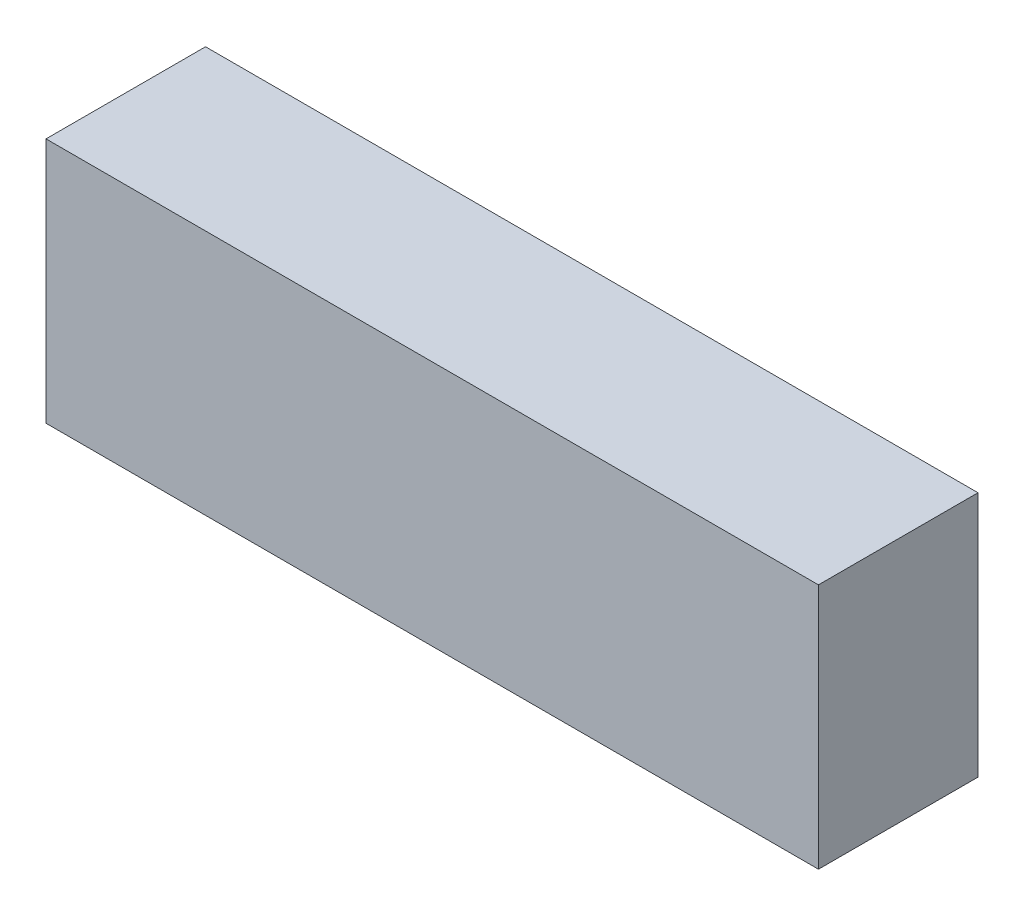
ISO-10303-21;
HEADER;
FILE_DESCRIPTION(('STEP AP214'),'2;1');
FILE_NAME('part.step','',(''),(''),'','','');
FILE_SCHEMA(('AUTOMOTIVE_DESIGN { 1 0 10303 214 1 1 1 1 }'));
ENDSEC;
DATA;
#1=APPLICATION_CONTEXT('core data for automotive mechanical design processes');
#2=APPLICATION_PROTOCOL_DEFINITION('international standard','automotive_design',2000,#1);
#3=PRODUCT_CONTEXT('',#1,'mechanical');
#4=PRODUCT('Part','Part','',(#3));
#5=PRODUCT_RELATED_PRODUCT_CATEGORY('part','',(#4));
#6=PRODUCT_DEFINITION_FORMATION('','',#4);
#7=PRODUCT_DEFINITION_CONTEXT('part definition',#1,'design');
#8=PRODUCT_DEFINITION('design','',#6,#7);
#9=PRODUCT_DEFINITION_SHAPE('','',#8);
#10=(LENGTH_UNIT() NAMED_UNIT(*) SI_UNIT(.MILLI.,.METRE.));
#11=(NAMED_UNIT(*) PLANE_ANGLE_UNIT() SI_UNIT($,.RADIAN.));
#12=(NAMED_UNIT(*) SI_UNIT($,.STERADIAN.) SOLID_ANGLE_UNIT());
#13=UNCERTAINTY_MEASURE_WITH_UNIT(LENGTH_MEASURE(1.E-05),#10,'distance_accuracy_value','');
#14=(GEOMETRIC_REPRESENTATION_CONTEXT(3) GLOBAL_UNCERTAINTY_ASSIGNED_CONTEXT((#13)) GLOBAL_UNIT_ASSIGNED_CONTEXT((#10,
#11,#12)) REPRESENTATION_CONTEXT('',''));
#15=CARTESIAN_POINT('',(0.,0.,0.));
#16=DIRECTION('',(0.,0.,1.));
#17=DIRECTION('',(1.,0.,0.));
#18=AXIS2_PLACEMENT_3D('',#15,#16,#17);
#19=CARTESIAN_POINT('',(0.,0.,28.5));
#20=DIRECTION('',(1.,0.,0.));
#21=DIRECTION('',(0.,0.,-1.));
#22=AXIS2_PLACEMENT_3D('',#19,#20,#21);
#23=PLANE('',#22);
#24=DIRECTION('',(0.,-1.,0.));
#25=VECTOR('',#24,1.);
#26=CARTESIAN_POINT('',(0.,0.,0.));
#27=LINE('',#26,#25);
#28=CARTESIAN_POINT('',(0.,44.,0.));
#29=VERTEX_POINT('',#28);
#30=CARTESIAN_POINT('',(0.,0.,0.));
#31=VERTEX_POINT('',#30);
#32=EDGE_CURVE('E102',#29,#31,#27,.T.);
#33=ORIENTED_EDGE('',*,*,#32,.T.);
#34=DIRECTION('',(0.,0.,-1.));
#35=VECTOR('',#34,1.);
#36=CARTESIAN_POINT('',(0.,0.,28.5));
#37=LINE('',#36,#35);
#38=CARTESIAN_POINT('',(0.,0.,28.5));
#39=VERTEX_POINT('',#38);
#40=EDGE_CURVE('E11',#39,#31,#37,.T.);
#41=ORIENTED_EDGE('',*,*,#40,.F.);
#42=DIRECTION('',(0.,-1.,0.));
#43=VECTOR('',#42,1.);
#44=CARTESIAN_POINT('',(0.,0.,28.5));
#45=LINE('',#44,#43);
#46=CARTESIAN_POINT('',(0.,44.,28.5));
#47=VERTEX_POINT('',#46);
#48=EDGE_CURVE('E90',#47,#39,#45,.T.);
#49=ORIENTED_EDGE('',*,*,#48,.F.);
#50=DIRECTION('',(0.,0.,-1.));
#51=VECTOR('',#50,1.);
#52=CARTESIAN_POINT('',(0.,44.,28.5));
#53=LINE('',#52,#51);
#54=EDGE_CURVE('E98',#47,#29,#53,.T.);
#55=ORIENTED_EDGE('',*,*,#54,.T.);
#56=EDGE_LOOP('',(#33,#41,#49,#55));
#57=FACE_BOUND('',#56,.T.);
#58=ADVANCED_FACE('F39',(#57),#23,.F.);
#59=CARTESIAN_POINT('',(0.,0.,28.5));
#60=DIRECTION('',(0.,1.,0.));
#61=DIRECTION('',(0.,0.,1.));
#62=AXIS2_PLACEMENT_3D('',#59,#60,#61);
#63=PLANE('',#62);
#64=DIRECTION('',(1.,0.,0.));
#65=VECTOR('',#64,1.);
#66=CARTESIAN_POINT('',(0.,0.,0.));
#67=LINE('',#66,#65);
#68=CARTESIAN_POINT('',(138.,0.,0.));
#69=VERTEX_POINT('',#68);
#70=EDGE_CURVE('E94',#31,#69,#67,.T.);
#71=ORIENTED_EDGE('',*,*,#70,.T.);
#72=DIRECTION('',(0.,0.,-1.));
#73=VECTOR('',#72,1.);
#74=CARTESIAN_POINT('',(138.,0.,28.5));
#75=LINE('',#74,#73);
#76=CARTESIAN_POINT('',(138.,0.,28.5));
#77=VERTEX_POINT('',#76);
#78=EDGE_CURVE('E47',#77,#69,#75,.T.);
#79=ORIENTED_EDGE('',*,*,#78,.F.);
#80=DIRECTION('',(1.,0.,0.));
#81=VECTOR('',#80,1.);
#82=CARTESIAN_POINT('',(0.,0.,28.5));
#83=LINE('',#82,#81);
#84=EDGE_CURVE('E85',#39,#77,#83,.T.);
#85=ORIENTED_EDGE('',*,*,#84,.F.);
#86=ORIENTED_EDGE('',*,*,#40,.T.);
#87=EDGE_LOOP('',(#71,#79,#85,#86));
#88=FACE_BOUND('',#87,.T.);
#89=ADVANCED_FACE('F93',(#88),#63,.F.);
#90=CARTESIAN_POINT('',(138.,0.,28.5));
#91=DIRECTION('',(-1.,0.,0.));
#92=DIRECTION('',(0.,0.,1.));
#93=AXIS2_PLACEMENT_3D('',#90,#91,#92);
#94=PLANE('',#93);
#95=DIRECTION('',(0.,1.,0.));
#96=VECTOR('',#95,1.);
#97=CARTESIAN_POINT('',(138.,0.,0.));
#98=LINE('',#97,#96);
#99=CARTESIAN_POINT('',(138.,44.,0.));
#100=VERTEX_POINT('',#99);
#101=EDGE_CURVE('E72',#69,#100,#98,.T.);
#102=ORIENTED_EDGE('',*,*,#101,.T.);
#103=DIRECTION('',(0.,0.,-1.));
#104=VECTOR('',#103,1.);
#105=CARTESIAN_POINT('',(138.,44.,28.5));
#106=LINE('',#105,#104);
#107=CARTESIAN_POINT('',(138.,44.,28.5));
#108=VERTEX_POINT('',#107);
#109=EDGE_CURVE('E95',#108,#100,#106,.T.);
#110=ORIENTED_EDGE('',*,*,#109,.F.);
#111=DIRECTION('',(0.,1.,0.));
#112=VECTOR('',#111,1.);
#113=CARTESIAN_POINT('',(138.,0.,28.5));
#114=LINE('',#113,#112);
#115=EDGE_CURVE('E88',#77,#108,#114,.T.);
#116=ORIENTED_EDGE('',*,*,#115,.F.);
#117=ORIENTED_EDGE('',*,*,#78,.T.);
#118=EDGE_LOOP('',(#102,#110,#116,#117));
#119=FACE_BOUND('',#118,.T.);
#120=ADVANCED_FACE('F96',(#119),#94,.F.);
#121=CARTESIAN_POINT('',(0.,44.,28.5));
#122=DIRECTION('',(0.,-1.,0.));
#123=DIRECTION('',(0.,0.,-1.));
#124=AXIS2_PLACEMENT_3D('',#121,#122,#123);
#125=PLANE('',#124);
#126=DIRECTION('',(-1.,0.,0.));
#127=VECTOR('',#126,1.);
#128=CARTESIAN_POINT('',(0.,44.,0.));
#129=LINE('',#128,#127);
#130=EDGE_CURVE('E78',#100,#29,#129,.T.);
#131=ORIENTED_EDGE('',*,*,#130,.T.);
#132=ORIENTED_EDGE('',*,*,#54,.F.);
#133=DIRECTION('',(-1.,0.,0.));
#134=VECTOR('',#133,1.);
#135=CARTESIAN_POINT('',(0.,44.,28.5));
#136=LINE('',#135,#134);
#137=EDGE_CURVE('E55',#108,#47,#136,.T.);
#138=ORIENTED_EDGE('',*,*,#137,.F.);
#139=ORIENTED_EDGE('',*,*,#109,.T.);
#140=EDGE_LOOP('',(#131,#132,#138,#139));
#141=FACE_BOUND('',#140,.T.);
#142=ADVANCED_FACE('F109',(#141),#125,.F.);
#143=CARTESIAN_POINT('',(0.,0.,28.5));
#144=DIRECTION('',(0.,0.,-1.));
#145=DIRECTION('',(-1.,0.,0.));
#146=AXIS2_PLACEMENT_3D('',#143,#144,#145);
#147=PLANE('',#146);
#148=ORIENTED_EDGE('',*,*,#48,.T.);
#149=ORIENTED_EDGE('',*,*,#84,.T.);
#150=ORIENTED_EDGE('',*,*,#115,.T.);
#151=ORIENTED_EDGE('',*,*,#137,.T.);
#152=EDGE_LOOP('',(#148,#149,#150,#151));
#153=FACE_BOUND('',#152,.T.);
#154=ADVANCED_FACE('F86',(#153),#147,.F.);
#155=CARTESIAN_POINT('',(0.,0.,0.));
#156=DIRECTION('',(0.,0.,-1.));
#157=DIRECTION('',(-1.,0.,0.));
#158=AXIS2_PLACEMENT_3D('',#155,#156,#157);
#159=PLANE('',#158);
#160=ORIENTED_EDGE('',*,*,#32,.F.);
#161=ORIENTED_EDGE('',*,*,#130,.F.);
#162=ORIENTED_EDGE('',*,*,#101,.F.);
#163=ORIENTED_EDGE('',*,*,#70,.F.);
#164=EDGE_LOOP('',(#160,#161,#162,#163));
#165=FACE_BOUND('',#164,.T.);
#166=ADVANCED_FACE('F112',(#165),#159,.T.);
#167=CLOSED_SHELL('',(#58,#89,#120,#142,#154,#166));
#168=MANIFOLD_SOLID_BREP('B2',#167);
#169=ADVANCED_BREP_SHAPE_REPRESENTATION('',(#18,#168),#14);
#170=SHAPE_DEFINITION_REPRESENTATION(#9,#169);
ENDSEC;
END-ISO-10303-21;
